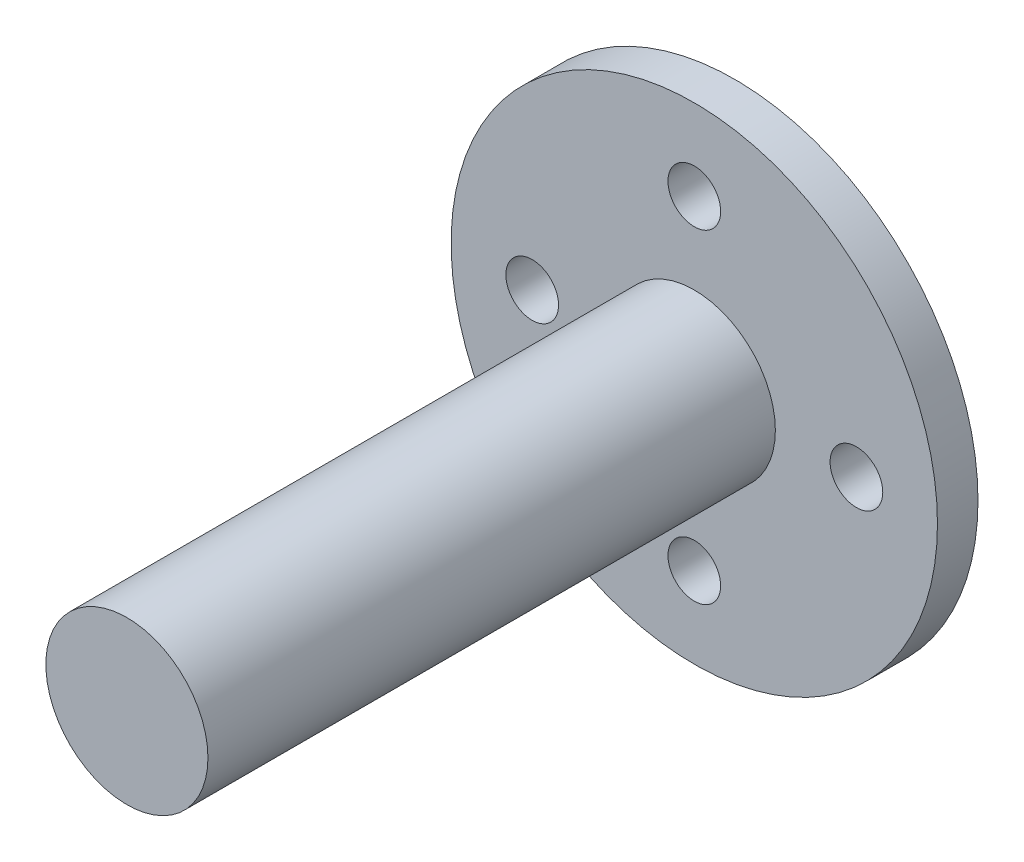
ISO-10303-21;
HEADER;
FILE_DESCRIPTION(('STEP AP214'),'2;1');
FILE_NAME('part.step','',(''),(''),'','','');
FILE_SCHEMA(('AUTOMOTIVE_DESIGN { 1 0 10303 214 1 1 1 1 }'));
ENDSEC;
DATA;
#1=APPLICATION_CONTEXT('core data for automotive mechanical design processes');
#2=APPLICATION_PROTOCOL_DEFINITION('international standard','automotive_design',2000,#1);
#3=PRODUCT_CONTEXT('',#1,'mechanical');
#4=PRODUCT('Part','Part','',(#3));
#5=PRODUCT_RELATED_PRODUCT_CATEGORY('part','',(#4));
#6=PRODUCT_DEFINITION_FORMATION('','',#4);
#7=PRODUCT_DEFINITION_CONTEXT('part definition',#1,'design');
#8=PRODUCT_DEFINITION('design','',#6,#7);
#9=PRODUCT_DEFINITION_SHAPE('','',#8);
#10=(LENGTH_UNIT() NAMED_UNIT(*) SI_UNIT(.MILLI.,.METRE.));
#11=(NAMED_UNIT(*) PLANE_ANGLE_UNIT() SI_UNIT($,.RADIAN.));
#12=(NAMED_UNIT(*) SI_UNIT($,.STERADIAN.) SOLID_ANGLE_UNIT());
#13=UNCERTAINTY_MEASURE_WITH_UNIT(LENGTH_MEASURE(1.E-05),#10,'distance_accuracy_value','');
#14=(GEOMETRIC_REPRESENTATION_CONTEXT(3) GLOBAL_UNCERTAINTY_ASSIGNED_CONTEXT((#13)) GLOBAL_UNIT_ASSIGNED_CONTEXT((#10,
#11,#12)) REPRESENTATION_CONTEXT('',''));
#15=CARTESIAN_POINT('',(0.,0.,0.));
#16=DIRECTION('',(0.,0.,1.));
#17=DIRECTION('',(1.,0.,0.));
#18=AXIS2_PLACEMENT_3D('',#15,#16,#17);
#19=CARTESIAN_POINT('',(0.,0.,5.));
#20=DIRECTION('',(0.,0.,1.));
#21=DIRECTION('',(1.,0.,0.));
#22=AXIS2_PLACEMENT_3D('',#19,#20,#21);
#23=PLANE('',#22);
#24=CARTESIAN_POINT('',(0.,0.,5.));
#25=DIRECTION('',(0.,0.,1.));
#26=DIRECTION('',(1.,0.,0.));
#27=AXIS2_PLACEMENT_3D('',#24,#25,#26);
#28=CIRCLE('',#27,10.);
#29=CARTESIAN_POINT('',(10.,0.,5.));
#30=VERTEX_POINT('',#29);
#31=EDGE_CURVE('E71',#30,#30,#28,.F.);
#32=ORIENTED_EDGE('',*,*,#31,.T.);
#33=EDGE_LOOP('',(#32));
#34=FACE_BOUND('',#33,.T.);
#35=CARTESIAN_POINT('',(-20.,0.,5.));
#36=DIRECTION('',(0.,0.,1.));
#37=DIRECTION('',(1.,0.,0.));
#38=AXIS2_PLACEMENT_3D('',#35,#36,#37);
#39=CIRCLE('',#38,3.25);
#40=CARTESIAN_POINT('',(-16.75,0.,5.));
#41=VERTEX_POINT('',#40);
#42=EDGE_CURVE('E63',#41,#41,#39,.T.);
#43=ORIENTED_EDGE('',*,*,#42,.F.);
#44=EDGE_LOOP('',(#43));
#45=FACE_BOUND('',#44,.T.);
#46=CARTESIAN_POINT('',(20.,0.,5.));
#47=DIRECTION('',(0.,0.,1.));
#48=DIRECTION('',(1.,0.,0.));
#49=AXIS2_PLACEMENT_3D('',#46,#47,#48);
#50=CIRCLE('',#49,3.25);
#51=CARTESIAN_POINT('',(23.25,0.,5.));
#52=VERTEX_POINT('',#51);
#53=EDGE_CURVE('E49',#52,#52,#50,.T.);
#54=ORIENTED_EDGE('',*,*,#53,.F.);
#55=EDGE_LOOP('',(#54));
#56=FACE_BOUND('',#55,.T.);
#57=CARTESIAN_POINT('',(0.,0.,5.));
#58=DIRECTION('',(0.,0.,1.));
#59=DIRECTION('',(1.,0.,0.));
#60=AXIS2_PLACEMENT_3D('',#57,#58,#59);
#61=CIRCLE('',#60,30.);
#62=CARTESIAN_POINT('',(30.,0.,5.));
#63=VERTEX_POINT('',#62);
#64=EDGE_CURVE('E10',#63,#63,#61,.T.);
#65=ORIENTED_EDGE('',*,*,#64,.T.);
#66=EDGE_LOOP('',(#65));
#67=FACE_BOUND('',#66,.T.);
#68=CARTESIAN_POINT('',(0.,20.,5.));
#69=DIRECTION('',(0.,0.,1.));
#70=DIRECTION('',(1.,0.,0.));
#71=AXIS2_PLACEMENT_3D('',#68,#69,#70);
#72=CIRCLE('',#71,3.25);
#73=CARTESIAN_POINT('',(3.25,20.,5.));
#74=VERTEX_POINT('',#73);
#75=EDGE_CURVE('E54',#74,#74,#72,.T.);
#76=ORIENTED_EDGE('',*,*,#75,.F.);
#77=EDGE_LOOP('',(#76));
#78=FACE_BOUND('',#77,.T.);
#79=CARTESIAN_POINT('',(0.,-20.,5.));
#80=DIRECTION('',(0.,0.,1.));
#81=DIRECTION('',(1.,0.,0.));
#82=AXIS2_PLACEMENT_3D('',#79,#80,#81);
#83=CIRCLE('',#82,3.25);
#84=CARTESIAN_POINT('',(3.25,-20.,5.));
#85=VERTEX_POINT('',#84);
#86=EDGE_CURVE('E70',#85,#85,#83,.T.);
#87=ORIENTED_EDGE('',*,*,#86,.F.);
#88=EDGE_LOOP('',(#87));
#89=FACE_BOUND('',#88,.T.);
#90=ADVANCED_FACE('F39',(#34,#45,#56,#67,#78,#89),#23,.T.);
#91=CARTESIAN_POINT('',(0.,0.,0.));
#92=DIRECTION('',(0.,0.,1.));
#93=DIRECTION('',(1.,0.,0.));
#94=AXIS2_PLACEMENT_3D('',#91,#92,#93);
#95=PLANE('',#94);
#96=CARTESIAN_POINT('',(0.,0.,0.));
#97=DIRECTION('',(0.,0.,1.));
#98=DIRECTION('',(1.,0.,0.));
#99=AXIS2_PLACEMENT_3D('',#96,#97,#98);
#100=CIRCLE('',#99,30.);
#101=CARTESIAN_POINT('',(30.,0.,0.));
#102=VERTEX_POINT('',#101);
#103=EDGE_CURVE('E43',#102,#102,#100,.T.);
#104=ORIENTED_EDGE('',*,*,#103,.F.);
#105=EDGE_LOOP('',(#104));
#106=FACE_BOUND('',#105,.T.);
#107=CARTESIAN_POINT('',(20.,0.,0.));
#108=DIRECTION('',(0.,0.,1.));
#109=DIRECTION('',(1.,0.,0.));
#110=AXIS2_PLACEMENT_3D('',#107,#108,#109);
#111=CIRCLE('',#110,3.25);
#112=CARTESIAN_POINT('',(23.25,0.,0.));
#113=VERTEX_POINT('',#112);
#114=EDGE_CURVE('E55',#113,#113,#111,.T.);
#115=ORIENTED_EDGE('',*,*,#114,.T.);
#116=EDGE_LOOP('',(#115));
#117=FACE_BOUND('',#116,.T.);
#118=CARTESIAN_POINT('',(0.,20.,0.));
#119=DIRECTION('',(0.,0.,1.));
#120=DIRECTION('',(1.,0.,0.));
#121=AXIS2_PLACEMENT_3D('',#118,#119,#120);
#122=CIRCLE('',#121,3.25);
#123=CARTESIAN_POINT('',(3.25,20.,0.));
#124=VERTEX_POINT('',#123);
#125=EDGE_CURVE('E59',#124,#124,#122,.T.);
#126=ORIENTED_EDGE('',*,*,#125,.T.);
#127=EDGE_LOOP('',(#126));
#128=FACE_BOUND('',#127,.T.);
#129=CARTESIAN_POINT('',(-20.,0.,0.));
#130=DIRECTION('',(0.,0.,1.));
#131=DIRECTION('',(1.,0.,0.));
#132=AXIS2_PLACEMENT_3D('',#129,#130,#131);
#133=CIRCLE('',#132,3.25);
#134=CARTESIAN_POINT('',(-16.75,0.,0.));
#135=VERTEX_POINT('',#134);
#136=EDGE_CURVE('E65',#135,#135,#133,.T.);
#137=ORIENTED_EDGE('',*,*,#136,.T.);
#138=EDGE_LOOP('',(#137));
#139=FACE_BOUND('',#138,.T.);
#140=CARTESIAN_POINT('',(0.,-20.,0.));
#141=DIRECTION('',(0.,0.,1.));
#142=DIRECTION('',(1.,0.,0.));
#143=AXIS2_PLACEMENT_3D('',#140,#141,#142);
#144=CIRCLE('',#143,3.25);
#145=CARTESIAN_POINT('',(3.25,-20.,0.));
#146=VERTEX_POINT('',#145);
#147=EDGE_CURVE('E69',#146,#146,#144,.T.);
#148=ORIENTED_EDGE('',*,*,#147,.T.);
#149=EDGE_LOOP('',(#148));
#150=FACE_BOUND('',#149,.T.);
#151=ADVANCED_FACE('F99',(#106,#117,#128,#139,#150),#95,.F.);
#152=CARTESIAN_POINT('',(0.,0.,5.));
#153=DIRECTION('',(0.,0.,-1.));
#154=DIRECTION('',(-1.,0.,0.));
#155=AXIS2_PLACEMENT_3D('',#152,#153,#154);
#156=CYLINDRICAL_SURFACE('',#155,30.);
#157=ORIENTED_EDGE('',*,*,#64,.F.);
#158=EDGE_LOOP('',(#157));
#159=FACE_BOUND('',#158,.T.);
#160=ORIENTED_EDGE('',*,*,#103,.T.);
#161=EDGE_LOOP('',(#160));
#162=FACE_BOUND('',#161,.T.);
#163=ADVANCED_FACE('F41',(#159,#162),#156,.T.);
#164=CARTESIAN_POINT('',(20.,0.,5.));
#165=DIRECTION('',(0.,0.,-1.));
#166=DIRECTION('',(-1.,0.,0.));
#167=AXIS2_PLACEMENT_3D('',#164,#165,#166);
#168=CYLINDRICAL_SURFACE('',#167,3.25);
#169=ORIENTED_EDGE('',*,*,#53,.T.);
#170=EDGE_LOOP('',(#169));
#171=FACE_BOUND('',#170,.T.);
#172=ORIENTED_EDGE('',*,*,#114,.F.);
#173=EDGE_LOOP('',(#172));
#174=FACE_BOUND('',#173,.T.);
#175=ADVANCED_FACE('F108',(#171,#174),#168,.F.);
#176=CARTESIAN_POINT('',(0.,20.,5.));
#177=DIRECTION('',(0.,0.,-1.));
#178=DIRECTION('',(-1.,0.,0.));
#179=AXIS2_PLACEMENT_3D('',#176,#177,#178);
#180=CYLINDRICAL_SURFACE('',#179,3.25);
#181=ORIENTED_EDGE('',*,*,#75,.T.);
#182=EDGE_LOOP('',(#181));
#183=FACE_BOUND('',#182,.T.);
#184=ORIENTED_EDGE('',*,*,#125,.F.);
#185=EDGE_LOOP('',(#184));
#186=FACE_BOUND('',#185,.T.);
#187=ADVANCED_FACE('F111',(#183,#186),#180,.F.);
#188=CARTESIAN_POINT('',(-20.,0.,5.));
#189=DIRECTION('',(0.,0.,-1.));
#190=DIRECTION('',(-1.,0.,0.));
#191=AXIS2_PLACEMENT_3D('',#188,#189,#190);
#192=CYLINDRICAL_SURFACE('',#191,3.25);
#193=ORIENTED_EDGE('',*,*,#42,.T.);
#194=EDGE_LOOP('',(#193));
#195=FACE_BOUND('',#194,.T.);
#196=ORIENTED_EDGE('',*,*,#136,.F.);
#197=EDGE_LOOP('',(#196));
#198=FACE_BOUND('',#197,.T.);
#199=ADVANCED_FACE('F94',(#195,#198),#192,.F.);
#200=CARTESIAN_POINT('',(0.,-20.,5.));
#201=DIRECTION('',(0.,0.,-1.));
#202=DIRECTION('',(-1.,0.,0.));
#203=AXIS2_PLACEMENT_3D('',#200,#201,#202);
#204=CYLINDRICAL_SURFACE('',#203,3.25);
#205=ORIENTED_EDGE('',*,*,#86,.T.);
#206=EDGE_LOOP('',(#205));
#207=FACE_BOUND('',#206,.T.);
#208=ORIENTED_EDGE('',*,*,#147,.F.);
#209=EDGE_LOOP('',(#208));
#210=FACE_BOUND('',#209,.T.);
#211=ADVANCED_FACE('F86',(#207,#210),#204,.F.);
#212=CARTESIAN_POINT('',(0.,0.,75.));
#213=DIRECTION('',(0.,0.,-1.));
#214=DIRECTION('',(-1.,0.,0.));
#215=AXIS2_PLACEMENT_3D('',#212,#213,#214);
#216=CYLINDRICAL_SURFACE('',#215,10.);
#217=ORIENTED_EDGE('',*,*,#31,.F.);
#218=EDGE_LOOP('',(#217));
#219=FACE_BOUND('',#218,.T.);
#220=CARTESIAN_POINT('',(0.,0.,75.));
#221=DIRECTION('',(0.,0.,1.));
#222=DIRECTION('',(1.,0.,0.));
#223=AXIS2_PLACEMENT_3D('',#220,#221,#222);
#224=CIRCLE('',#223,10.);
#225=CARTESIAN_POINT('',(10.,0.,75.));
#226=VERTEX_POINT('',#225);
#227=EDGE_CURVE('E76',#226,#226,#224,.T.);
#228=ORIENTED_EDGE('',*,*,#227,.F.);
#229=EDGE_LOOP('',(#228));
#230=FACE_BOUND('',#229,.T.);
#231=ADVANCED_FACE('F85',(#219,#230),#216,.T.);
#232=CARTESIAN_POINT('',(0.,0.,75.));
#233=DIRECTION('',(0.,0.,1.));
#234=DIRECTION('',(1.,0.,0.));
#235=AXIS2_PLACEMENT_3D('',#232,#233,#234);
#236=PLANE('',#235);
#237=ORIENTED_EDGE('',*,*,#227,.T.);
#238=EDGE_LOOP('',(#237));
#239=FACE_BOUND('',#238,.T.);
#240=ADVANCED_FACE('F84',(#239),#236,.T.);
#241=CLOSED_SHELL('',(#90,#151,#163,#175,#187,#199,#211,#231,#240));
#242=MANIFOLD_SOLID_BREP('B2',#241);
#243=ADVANCED_BREP_SHAPE_REPRESENTATION('',(#18,#242),#14);
#244=SHAPE_DEFINITION_REPRESENTATION(#9,#243);
ENDSEC;
END-ISO-10303-21;
